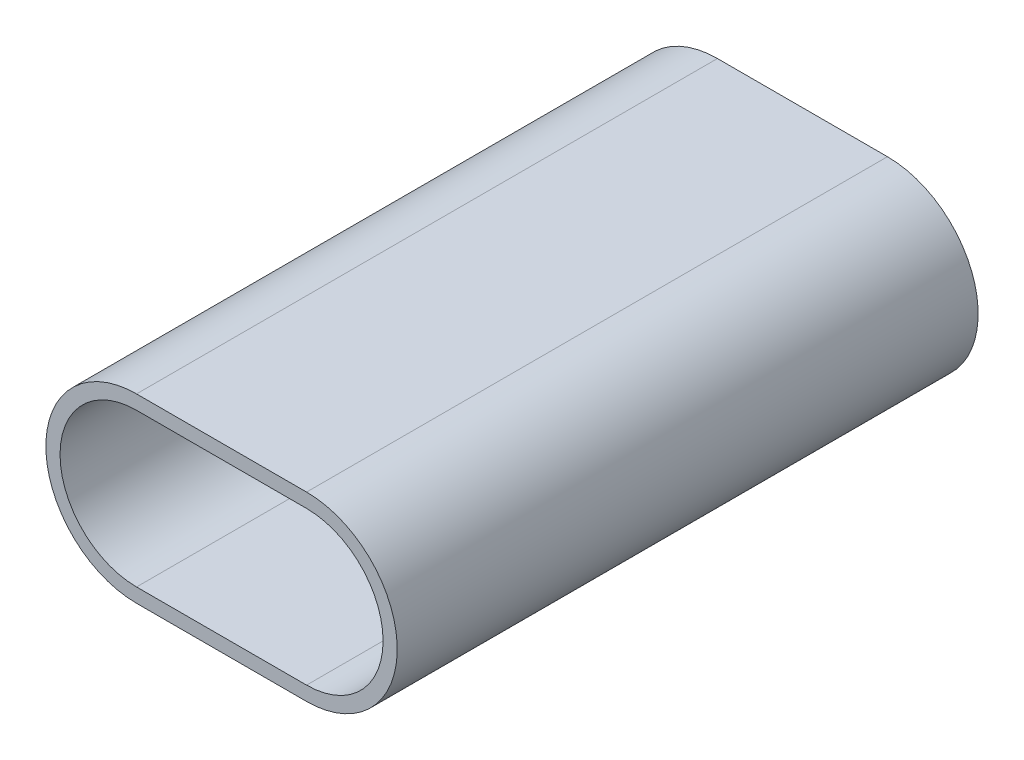
ISO-10303-21;
HEADER;
FILE_DESCRIPTION(('STEP AP214'),'2;1');
FILE_NAME('part.step','',(''),(''),'','','');
FILE_SCHEMA(('AUTOMOTIVE_DESIGN { 1 0 10303 214 1 1 1 1 }'));
ENDSEC;
DATA;
#1=APPLICATION_CONTEXT('core data for automotive mechanical design processes');
#2=APPLICATION_PROTOCOL_DEFINITION('international standard','automotive_design',2000,#1);
#3=PRODUCT_CONTEXT('',#1,'mechanical');
#4=PRODUCT('Part','Part','',(#3));
#5=PRODUCT_RELATED_PRODUCT_CATEGORY('part','',(#4));
#6=PRODUCT_DEFINITION_FORMATION('','',#4);
#7=PRODUCT_DEFINITION_CONTEXT('part definition',#1,'design');
#8=PRODUCT_DEFINITION('design','',#6,#7);
#9=PRODUCT_DEFINITION_SHAPE('','',#8);
#10=(LENGTH_UNIT() NAMED_UNIT(*) SI_UNIT(.MILLI.,.METRE.));
#11=(NAMED_UNIT(*) PLANE_ANGLE_UNIT() SI_UNIT($,.RADIAN.));
#12=(NAMED_UNIT(*) SI_UNIT($,.STERADIAN.) SOLID_ANGLE_UNIT());
#13=UNCERTAINTY_MEASURE_WITH_UNIT(LENGTH_MEASURE(1.E-05),#10,'distance_accuracy_value','');
#14=(GEOMETRIC_REPRESENTATION_CONTEXT(3) GLOBAL_UNCERTAINTY_ASSIGNED_CONTEXT((#13)) GLOBAL_UNIT_ASSIGNED_CONTEXT((#10,
#11,#12)) REPRESENTATION_CONTEXT('',''));
#15=CARTESIAN_POINT('',(0.,0.,0.));
#16=DIRECTION('',(0.,0.,1.));
#17=DIRECTION('',(1.,0.,0.));
#18=AXIS2_PLACEMENT_3D('',#15,#16,#17);
#19=CARTESIAN_POINT('',(-3.,0.,10.25));
#20=DIRECTION('',(0.,0.,-1.));
#21=DIRECTION('',(-1.,0.,0.));
#22=AXIS2_PLACEMENT_3D('',#19,#20,#21);
#23=CYLINDRICAL_SURFACE('',#22,3.2);
#24=CARTESIAN_POINT('',(-3.,0.,-10.25));
#25=DIRECTION('',(0.,0.,1.));
#26=DIRECTION('',(1.,0.,0.));
#27=AXIS2_PLACEMENT_3D('',#24,#25,#26);
#28=CIRCLE('',#27,3.2);
#29=CARTESIAN_POINT('',(-3.,3.2,-10.25));
#30=VERTEX_POINT('',#29);
#31=CARTESIAN_POINT('',(-3.,-3.2,-10.25));
#32=VERTEX_POINT('',#31);
#33=EDGE_CURVE('E140',#30,#32,#28,.T.);
#34=ORIENTED_EDGE('',*,*,#33,.T.);
#35=DIRECTION('',(0.,0.,-1.));
#36=VECTOR('',#35,1.);
#37=CARTESIAN_POINT('',(-3.,-3.2,10.25));
#38=LINE('',#37,#36);
#39=CARTESIAN_POINT('',(-3.,-3.2,10.25));
#40=VERTEX_POINT('',#39);
#41=EDGE_CURVE('E12',#40,#32,#38,.T.);
#42=ORIENTED_EDGE('',*,*,#41,.F.);
#43=CARTESIAN_POINT('',(-3.,0.,10.25));
#44=DIRECTION('',(0.,0.,1.));
#45=DIRECTION('',(1.,0.,0.));
#46=AXIS2_PLACEMENT_3D('',#43,#44,#45);
#47=CIRCLE('',#46,3.2);
#48=CARTESIAN_POINT('',(-3.,3.2,10.25));
#49=VERTEX_POINT('',#48);
#50=EDGE_CURVE('E142',#49,#40,#47,.T.);
#51=ORIENTED_EDGE('',*,*,#50,.F.);
#52=DIRECTION('',(0.,0.,-1.));
#53=VECTOR('',#52,1.);
#54=CARTESIAN_POINT('',(-3.,3.2,10.25));
#55=LINE('',#54,#53);
#56=EDGE_CURVE('E148',#49,#30,#55,.T.);
#57=ORIENTED_EDGE('',*,*,#56,.T.);
#58=EDGE_LOOP('',(#34,#42,#51,#57));
#59=FACE_BOUND('',#58,.T.);
#60=ADVANCED_FACE('F34',(#59),#23,.T.);
#61=CARTESIAN_POINT('',(-3.,-3.2,10.25));
#62=DIRECTION('',(0.,1.,0.));
#63=DIRECTION('',(0.,0.,1.));
#64=AXIS2_PLACEMENT_3D('',#61,#62,#63);
#65=PLANE('',#64);
#66=DIRECTION('',(1.,0.,0.));
#67=VECTOR('',#66,1.);
#68=CARTESIAN_POINT('',(-3.,-3.2,-10.25));
#69=LINE('',#68,#67);
#70=CARTESIAN_POINT('',(3.,-3.2,-10.25));
#71=VERTEX_POINT('',#70);
#72=EDGE_CURVE('E151',#32,#71,#69,.T.);
#73=ORIENTED_EDGE('',*,*,#72,.T.);
#74=DIRECTION('',(0.,0.,-1.));
#75=VECTOR('',#74,1.);
#76=CARTESIAN_POINT('',(3.,-3.2,10.25));
#77=LINE('',#76,#75);
#78=CARTESIAN_POINT('',(3.,-3.2,10.25));
#79=VERTEX_POINT('',#78);
#80=EDGE_CURVE('E41',#79,#71,#77,.T.);
#81=ORIENTED_EDGE('',*,*,#80,.F.);
#82=DIRECTION('',(1.,0.,0.));
#83=VECTOR('',#82,1.);
#84=CARTESIAN_POINT('',(-3.,-3.2,10.25));
#85=LINE('',#84,#83);
#86=EDGE_CURVE('E85',#40,#79,#85,.T.);
#87=ORIENTED_EDGE('',*,*,#86,.F.);
#88=ORIENTED_EDGE('',*,*,#41,.T.);
#89=EDGE_LOOP('',(#73,#81,#87,#88));
#90=FACE_BOUND('',#89,.T.);
#91=ADVANCED_FACE('F178',(#90),#65,.F.);
#92=CARTESIAN_POINT('',(3.,0.,10.25));
#93=DIRECTION('',(0.,0.,-1.));
#94=DIRECTION('',(-1.,0.,0.));
#95=AXIS2_PLACEMENT_3D('',#92,#93,#94);
#96=CYLINDRICAL_SURFACE('',#95,3.2);
#97=CARTESIAN_POINT('',(3.,0.,-10.25));
#98=DIRECTION('',(0.,0.,1.));
#99=DIRECTION('',(1.,0.,0.));
#100=AXIS2_PLACEMENT_3D('',#97,#98,#99);
#101=CIRCLE('',#100,3.2);
#102=CARTESIAN_POINT('',(3.,3.2,-10.25));
#103=VERTEX_POINT('',#102);
#104=EDGE_CURVE('E153',#71,#103,#101,.T.);
#105=ORIENTED_EDGE('',*,*,#104,.T.);
#106=DIRECTION('',(0.,0.,-1.));
#107=VECTOR('',#106,1.);
#108=CARTESIAN_POINT('',(3.,3.2,10.25));
#109=LINE('',#108,#107);
#110=CARTESIAN_POINT('',(3.,3.2,10.25));
#111=VERTEX_POINT('',#110);
#112=EDGE_CURVE('E157',#111,#103,#109,.T.);
#113=ORIENTED_EDGE('',*,*,#112,.F.);
#114=CARTESIAN_POINT('',(3.,0.,10.25));
#115=DIRECTION('',(0.,0.,1.));
#116=DIRECTION('',(1.,0.,0.));
#117=AXIS2_PLACEMENT_3D('',#114,#115,#116);
#118=CIRCLE('',#117,3.2);
#119=EDGE_CURVE('E145',#79,#111,#118,.T.);
#120=ORIENTED_EDGE('',*,*,#119,.F.);
#121=ORIENTED_EDGE('',*,*,#80,.T.);
#122=EDGE_LOOP('',(#105,#113,#120,#121));
#123=FACE_BOUND('',#122,.T.);
#124=ADVANCED_FACE('F162',(#123),#96,.T.);
#125=CARTESIAN_POINT('',(-3.,3.2,10.25));
#126=DIRECTION('',(0.,-1.,0.));
#127=DIRECTION('',(0.,0.,-1.));
#128=AXIS2_PLACEMENT_3D('',#125,#126,#127);
#129=PLANE('',#128);
#130=DIRECTION('',(-1.,0.,0.));
#131=VECTOR('',#130,1.);
#132=CARTESIAN_POINT('',(-3.,3.2,-10.25));
#133=LINE('',#132,#131);
#134=EDGE_CURVE('E78',#103,#30,#133,.T.);
#135=ORIENTED_EDGE('',*,*,#134,.T.);
#136=ORIENTED_EDGE('',*,*,#56,.F.);
#137=DIRECTION('',(-1.,0.,0.));
#138=VECTOR('',#137,1.);
#139=CARTESIAN_POINT('',(-3.,3.2,10.25));
#140=LINE('',#139,#138);
#141=EDGE_CURVE('E57',#111,#49,#140,.T.);
#142=ORIENTED_EDGE('',*,*,#141,.F.);
#143=ORIENTED_EDGE('',*,*,#112,.T.);
#144=EDGE_LOOP('',(#135,#136,#142,#143));
#145=FACE_BOUND('',#144,.T.);
#146=ADVANCED_FACE('F170',(#145),#129,.F.);
#147=CARTESIAN_POINT('',(-3.,0.,10.25));
#148=DIRECTION('',(0.,0.,1.));
#149=DIRECTION('',(1.,0.,0.));
#150=AXIS2_PLACEMENT_3D('',#147,#148,#149);
#151=PLANE('',#150);
#152=CARTESIAN_POINT('',(-3.,0.,10.25));
#153=DIRECTION('',(0.,0.,1.));
#154=DIRECTION('',(1.,0.,0.));
#155=AXIS2_PLACEMENT_3D('',#152,#153,#154);
#156=CIRCLE('',#155,2.7);
#157=CARTESIAN_POINT('',(-3.,2.7,10.25));
#158=VERTEX_POINT('',#157);
#159=CARTESIAN_POINT('',(-3.,-2.7,10.25));
#160=VERTEX_POINT('',#159);
#161=EDGE_CURVE('E48',#158,#160,#156,.T.);
#162=ORIENTED_EDGE('',*,*,#161,.F.);
#163=DIRECTION('',(-1.,0.,0.));
#164=VECTOR('',#163,1.);
#165=CARTESIAN_POINT('',(3.,2.7,10.25));
#166=LINE('',#165,#164);
#167=CARTESIAN_POINT('',(3.,2.7,10.25));
#168=VERTEX_POINT('',#167);
#169=EDGE_CURVE('E129',#168,#158,#166,.T.);
#170=ORIENTED_EDGE('',*,*,#169,.F.);
#171=CARTESIAN_POINT('',(3.,0.,10.25));
#172=DIRECTION('',(0.,0.,1.));
#173=DIRECTION('',(1.,0.,0.));
#174=AXIS2_PLACEMENT_3D('',#171,#172,#173);
#175=CIRCLE('',#174,2.7);
#176=CARTESIAN_POINT('',(3.,-2.7,10.25));
#177=VERTEX_POINT('',#176);
#178=EDGE_CURVE('E113',#177,#168,#175,.T.);
#179=ORIENTED_EDGE('',*,*,#178,.F.);
#180=DIRECTION('',(1.,0.,0.));
#181=VECTOR('',#180,1.);
#182=CARTESIAN_POINT('',(-3.,-2.7,10.25));
#183=LINE('',#182,#181);
#184=EDGE_CURVE('E123',#160,#177,#183,.T.);
#185=ORIENTED_EDGE('',*,*,#184,.F.);
#186=EDGE_LOOP('',(#162,#170,#179,#185));
#187=FACE_BOUND('',#186,.T.);
#188=ORIENTED_EDGE('',*,*,#50,.T.);
#189=ORIENTED_EDGE('',*,*,#86,.T.);
#190=ORIENTED_EDGE('',*,*,#119,.T.);
#191=ORIENTED_EDGE('',*,*,#141,.T.);
#192=EDGE_LOOP('',(#188,#189,#190,#191));
#193=FACE_BOUND('',#192,.T.);
#194=ADVANCED_FACE('F127',(#187,#193),#151,.T.);
#195=CARTESIAN_POINT('',(-3.,0.,-10.25));
#196=DIRECTION('',(0.,0.,1.));
#197=DIRECTION('',(1.,0.,0.));
#198=AXIS2_PLACEMENT_3D('',#195,#196,#197);
#199=PLANE('',#198);
#200=CARTESIAN_POINT('',(0.,0.,-10.25));
#201=DIRECTION('',(0.,0.,-1.));
#202=DIRECTION('',(-1.,0.,0.));
#203=AXIS2_PLACEMENT_3D('',#200,#201,#202);
#204=CIRCLE('',#203,2.);
#205=CARTESIAN_POINT('',(-2.,0.,-10.25));
#206=VERTEX_POINT('',#205);
#207=EDGE_CURVE('E271',#206,#206,#204,.T.);
#208=ORIENTED_EDGE('',*,*,#207,.F.);
#209=EDGE_LOOP('',(#208));
#210=FACE_BOUND('',#209,.T.);
#211=ORIENTED_EDGE('',*,*,#33,.F.);
#212=ORIENTED_EDGE('',*,*,#134,.F.);
#213=ORIENTED_EDGE('',*,*,#104,.F.);
#214=ORIENTED_EDGE('',*,*,#72,.F.);
#215=EDGE_LOOP('',(#211,#212,#213,#214));
#216=FACE_BOUND('',#215,.T.);
#217=ADVANCED_FACE('F166',(#210,#216),#199,.F.);
#218=CARTESIAN_POINT('',(-3.,0.,-22.8642776249772));
#219=DIRECTION('',(0.,0.,1.));
#220=DIRECTION('',(1.,0.,0.));
#221=AXIS2_PLACEMENT_3D('',#218,#219,#220);
#222=CYLINDRICAL_SURFACE('',#221,2.7);
#223=CARTESIAN_POINT('',(-3.,0.,-9.25));
#224=DIRECTION('',(0.,0.,1.));
#225=DIRECTION('',(1.,0.,0.));
#226=AXIS2_PLACEMENT_3D('',#223,#224,#225);
#227=CIRCLE('',#226,2.7);
#228=CARTESIAN_POINT('',(-3.,-2.7,-9.25));
#229=VERTEX_POINT('',#228);
#230=CARTESIAN_POINT('',(-3.,2.7,-9.25));
#231=VERTEX_POINT('',#230);
#232=EDGE_CURVE('E141',#229,#231,#227,.F.);
#233=ORIENTED_EDGE('',*,*,#232,.T.);
#234=DIRECTION('',(0.,0.,1.));
#235=VECTOR('',#234,1.);
#236=CARTESIAN_POINT('',(-3.,2.7,-22.8642776249772));
#237=LINE('',#236,#235);
#238=EDGE_CURVE('E134',#231,#158,#237,.T.);
#239=ORIENTED_EDGE('',*,*,#238,.T.);
#240=ORIENTED_EDGE('',*,*,#161,.T.);
#241=DIRECTION('',(0.,0.,1.));
#242=VECTOR('',#241,1.);
#243=CARTESIAN_POINT('',(-3.,-2.7,-22.8642776249772));
#244=LINE('',#243,#242);
#245=EDGE_CURVE('E120',#229,#160,#244,.T.);
#246=ORIENTED_EDGE('',*,*,#245,.F.);
#247=EDGE_LOOP('',(#233,#239,#240,#246));
#248=FACE_BOUND('',#247,.T.);
#249=ADVANCED_FACE('F208',(#248),#222,.F.);
#250=CARTESIAN_POINT('',(3.,2.7,-22.8642776249772));
#251=DIRECTION('',(0.,1.,0.));
#252=DIRECTION('',(-1.,0.,0.));
#253=AXIS2_PLACEMENT_3D('',#250,#251,#252);
#254=PLANE('',#253);
#255=DIRECTION('',(1.,0.,0.));
#256=VECTOR('',#255,1.);
#257=CARTESIAN_POINT('',(3.,2.7,-9.25));
#258=LINE('',#257,#256);
#259=CARTESIAN_POINT('',(3.,2.7,-9.25));
#260=VERTEX_POINT('',#259);
#261=EDGE_CURVE('E279',#231,#260,#258,.T.);
#262=ORIENTED_EDGE('',*,*,#261,.T.);
#263=DIRECTION('',(0.,0.,1.));
#264=VECTOR('',#263,1.);
#265=CARTESIAN_POINT('',(3.,2.7,-22.8642776249772));
#266=LINE('',#265,#264);
#267=EDGE_CURVE('E119',#260,#168,#266,.T.);
#268=ORIENTED_EDGE('',*,*,#267,.T.);
#269=ORIENTED_EDGE('',*,*,#169,.T.);
#270=ORIENTED_EDGE('',*,*,#238,.F.);
#271=EDGE_LOOP('',(#262,#268,#269,#270));
#272=FACE_BOUND('',#271,.T.);
#273=ADVANCED_FACE('F213',(#272),#254,.F.);
#274=CARTESIAN_POINT('',(3.,0.,-22.8642776249772));
#275=DIRECTION('',(0.,0.,1.));
#276=DIRECTION('',(1.,0.,0.));
#277=AXIS2_PLACEMENT_3D('',#274,#275,#276);
#278=CYLINDRICAL_SURFACE('',#277,2.7);
#279=CARTESIAN_POINT('',(3.,0.,-9.25));
#280=DIRECTION('',(0.,0.,1.));
#281=DIRECTION('',(1.,0.,0.));
#282=AXIS2_PLACEMENT_3D('',#279,#280,#281);
#283=CIRCLE('',#282,2.7);
#284=CARTESIAN_POINT('',(3.,-2.7,-9.25));
#285=VERTEX_POINT('',#284);
#286=EDGE_CURVE('E116',#260,#285,#283,.F.);
#287=ORIENTED_EDGE('',*,*,#286,.T.);
#288=DIRECTION('',(0.,0.,1.));
#289=VECTOR('',#288,1.);
#290=CARTESIAN_POINT('',(3.,-2.7,-22.8642776249772));
#291=LINE('',#290,#289);
#292=EDGE_CURVE('E108',#285,#177,#291,.T.);
#293=ORIENTED_EDGE('',*,*,#292,.T.);
#294=ORIENTED_EDGE('',*,*,#178,.T.);
#295=ORIENTED_EDGE('',*,*,#267,.F.);
#296=EDGE_LOOP('',(#287,#293,#294,#295));
#297=FACE_BOUND('',#296,.T.);
#298=ADVANCED_FACE('F110',(#297),#278,.F.);
#299=CARTESIAN_POINT('',(-3.,-2.7,-22.8642776249772));
#300=DIRECTION('',(0.,-1.,0.));
#301=DIRECTION('',(1.,0.,0.));
#302=AXIS2_PLACEMENT_3D('',#299,#300,#301);
#303=PLANE('',#302);
#304=DIRECTION('',(-1.,0.,0.));
#305=VECTOR('',#304,1.);
#306=CARTESIAN_POINT('',(-3.,-2.7,-9.25));
#307=LINE('',#306,#305);
#308=EDGE_CURVE('E138',#285,#229,#307,.T.);
#309=ORIENTED_EDGE('',*,*,#308,.T.);
#310=ORIENTED_EDGE('',*,*,#245,.T.);
#311=ORIENTED_EDGE('',*,*,#184,.T.);
#312=ORIENTED_EDGE('',*,*,#292,.F.);
#313=EDGE_LOOP('',(#309,#310,#311,#312));
#314=FACE_BOUND('',#313,.T.);
#315=ADVANCED_FACE('F124',(#314),#303,.F.);
#316=CARTESIAN_POINT('',(-3.,0.,-9.25));
#317=DIRECTION('',(0.,0.,1.));
#318=DIRECTION('',(1.,0.,0.));
#319=AXIS2_PLACEMENT_3D('',#316,#317,#318);
#320=PLANE('',#319);
#321=CARTESIAN_POINT('',(0.,0.,-9.25));
#322=DIRECTION('',(0.,0.,1.));
#323=DIRECTION('',(1.,0.,0.));
#324=AXIS2_PLACEMENT_3D('',#321,#322,#323);
#325=CIRCLE('',#324,2.);
#326=CARTESIAN_POINT('',(2.,0.,-9.25));
#327=VERTEX_POINT('',#326);
#328=EDGE_CURVE('E274',#327,#327,#325,.F.);
#329=ORIENTED_EDGE('',*,*,#328,.T.);
#330=EDGE_LOOP('',(#329));
#331=FACE_BOUND('',#330,.T.);
#332=ORIENTED_EDGE('',*,*,#232,.F.);
#333=ORIENTED_EDGE('',*,*,#308,.F.);
#334=ORIENTED_EDGE('',*,*,#286,.F.);
#335=ORIENTED_EDGE('',*,*,#261,.F.);
#336=EDGE_LOOP('',(#332,#333,#334,#335));
#337=FACE_BOUND('',#336,.T.);
#338=ADVANCED_FACE('F239',(#331,#337),#320,.T.);
#339=CARTESIAN_POINT('',(0.,0.,-3.59314575050762));
#340=DIRECTION('',(0.,0.,-1.));
#341=DIRECTION('',(-1.,0.,0.));
#342=AXIS2_PLACEMENT_3D('',#339,#340,#341);
#343=CYLINDRICAL_SURFACE('',#342,2.);
#344=ORIENTED_EDGE('',*,*,#207,.T.);
#345=EDGE_LOOP('',(#344));
#346=FACE_BOUND('',#345,.T.);
#347=ORIENTED_EDGE('',*,*,#328,.F.);
#348=EDGE_LOOP('',(#347));
#349=FACE_BOUND('',#348,.T.);
#350=ADVANCED_FACE('F254',(#346,#349),#343,.F.);
#351=CLOSED_SHELL('',(#60,#91,#124,#146,#194,#217,#249,#273,#298,#315,#338,#350));
#352=MANIFOLD_SOLID_BREP('B2',#351);
#353=ADVANCED_BREP_SHAPE_REPRESENTATION('',(#18,#352),#14);
#354=SHAPE_DEFINITION_REPRESENTATION(#9,#353);
ENDSEC;
END-ISO-10303-21;
